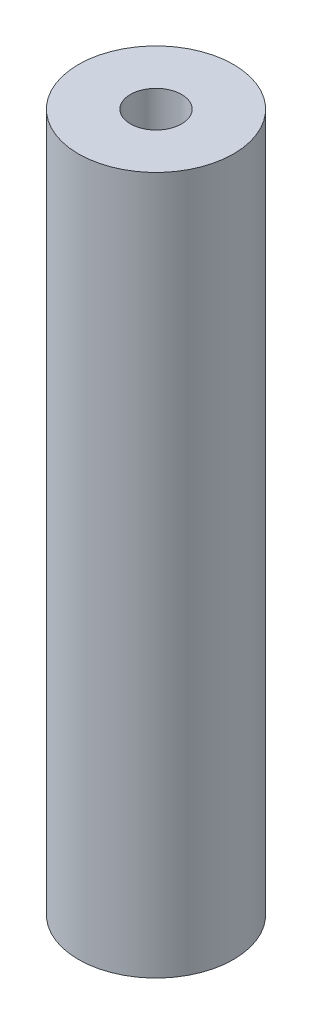
ISO-10303-21;
HEADER;
FILE_DESCRIPTION(('STEP AP214'),'2;1');
FILE_NAME('part.step','',(''),(''),'','','');
FILE_SCHEMA(('AUTOMOTIVE_DESIGN { 1 0 10303 214 1 1 1 1 }'));
ENDSEC;
DATA;
#1=APPLICATION_CONTEXT('core data for automotive mechanical design processes');
#2=APPLICATION_PROTOCOL_DEFINITION('international standard','automotive_design',2000,#1);
#3=PRODUCT_CONTEXT('',#1,'mechanical');
#4=PRODUCT('Part','Part','',(#3));
#5=PRODUCT_RELATED_PRODUCT_CATEGORY('part','',(#4));
#6=PRODUCT_DEFINITION_FORMATION('','',#4);
#7=PRODUCT_DEFINITION_CONTEXT('part definition',#1,'design');
#8=PRODUCT_DEFINITION('design','',#6,#7);
#9=PRODUCT_DEFINITION_SHAPE('','',#8);
#10=(LENGTH_UNIT() NAMED_UNIT(*) SI_UNIT(.MILLI.,.METRE.));
#11=(NAMED_UNIT(*) PLANE_ANGLE_UNIT() SI_UNIT($,.RADIAN.));
#12=(NAMED_UNIT(*) SI_UNIT($,.STERADIAN.) SOLID_ANGLE_UNIT());
#13=UNCERTAINTY_MEASURE_WITH_UNIT(LENGTH_MEASURE(1.E-05),#10,'distance_accuracy_value','');
#14=(GEOMETRIC_REPRESENTATION_CONTEXT(3) GLOBAL_UNCERTAINTY_ASSIGNED_CONTEXT((#13)) GLOBAL_UNIT_ASSIGNED_CONTEXT((#10,
#11,#12)) REPRESENTATION_CONTEXT('',''));
#15=CARTESIAN_POINT('',(0.,0.,0.));
#16=DIRECTION('',(0.,0.,1.));
#17=DIRECTION('',(1.,0.,0.));
#18=AXIS2_PLACEMENT_3D('',#15,#16,#17);
#19=CARTESIAN_POINT('',(0.,45.,0.));
#20=DIRECTION('',(0.,-1.,0.));
#21=DIRECTION('',(0.,0.,-1.));
#22=AXIS2_PLACEMENT_3D('',#19,#20,#21);
#23=CYLINDRICAL_SURFACE('',#22,5.);
#24=CARTESIAN_POINT('',(0.,45.,0.));
#25=DIRECTION('',(0.,1.,0.));
#26=DIRECTION('',(0.,0.,1.));
#27=AXIS2_PLACEMENT_3D('',#24,#25,#26);
#28=CIRCLE('',#27,5.);
#29=CARTESIAN_POINT('',(0.,45.,-5.));
#30=VERTEX_POINT('',#29);
#31=EDGE_CURVE('E11',#30,#30,#28,.T.);
#32=CARTESIAN_POINT('',(0.,0.,0.));
#33=DIRECTION('',(0.,1.,0.));
#34=DIRECTION('',(0.,0.,1.));
#35=AXIS2_PLACEMENT_3D('',#32,#33,#34);
#36=CIRCLE('',#35,5.);
#37=CARTESIAN_POINT('',(0.,0.,-5.));
#38=VERTEX_POINT('',#37);
#39=EDGE_CURVE('E38',#38,#38,#36,.T.);
#40=CARTESIAN_POINT('',(0.,45.,-5.));
#41=CARTESIAN_POINT('',(0.,44.53125,-5.));
#42=CARTESIAN_POINT('',(0.,44.0625,-5.));
#43=CARTESIAN_POINT('',(0.,43.125,-5.));
#44=CARTESIAN_POINT('',(0.,42.65625,-5.));
#45=CARTESIAN_POINT('',(0.,41.71875,-5.));
#46=CARTESIAN_POINT('',(0.,41.25,-5.));
#47=CARTESIAN_POINT('',(0.,40.3125,-5.));
#48=CARTESIAN_POINT('',(0.,39.84375,-5.));
#49=CARTESIAN_POINT('',(0.,38.90625,-5.));
#50=CARTESIAN_POINT('',(0.,38.4375,-5.));
#51=CARTESIAN_POINT('',(0.,37.5,-5.));
#52=CARTESIAN_POINT('',(0.,37.03125,-5.));
#53=CARTESIAN_POINT('',(0.,36.09375,-5.));
#54=CARTESIAN_POINT('',(0.,35.625,-5.));
#55=CARTESIAN_POINT('',(0.,34.6875,-5.));
#56=CARTESIAN_POINT('',(0.,34.21875,-5.));
#57=CARTESIAN_POINT('',(0.,33.28125,-5.));
#58=CARTESIAN_POINT('',(0.,32.8125,-5.));
#59=CARTESIAN_POINT('',(0.,31.875,-5.));
#60=CARTESIAN_POINT('',(0.,31.40625,-5.));
#61=CARTESIAN_POINT('',(0.,30.46875,-5.));
#62=CARTESIAN_POINT('',(0.,30.,-5.));
#63=CARTESIAN_POINT('',(0.,29.0625,-5.));
#64=CARTESIAN_POINT('',(0.,28.59375,-5.));
#65=CARTESIAN_POINT('',(0.,27.65625,-5.));
#66=CARTESIAN_POINT('',(0.,27.1875,-5.));
#67=CARTESIAN_POINT('',(0.,26.25,-5.));
#68=CARTESIAN_POINT('',(0.,25.78125,-5.));
#69=CARTESIAN_POINT('',(0.,24.84375,-5.));
#70=CARTESIAN_POINT('',(0.,24.375,-5.));
#71=CARTESIAN_POINT('',(0.,23.4375,-5.));
#72=CARTESIAN_POINT('',(0.,22.96875,-5.));
#73=CARTESIAN_POINT('',(0.,22.03125,-5.));
#74=CARTESIAN_POINT('',(0.,21.5625,-5.));
#75=CARTESIAN_POINT('',(0.,20.625,-5.));
#76=CARTESIAN_POINT('',(0.,20.15625,-5.));
#77=CARTESIAN_POINT('',(0.,19.21875,-5.));
#78=CARTESIAN_POINT('',(0.,18.75,-5.));
#79=CARTESIAN_POINT('',(0.,17.8125,-5.));
#80=CARTESIAN_POINT('',(0.,17.34375,-5.));
#81=CARTESIAN_POINT('',(0.,16.40625,-5.));
#82=CARTESIAN_POINT('',(0.,15.9375,-5.));
#83=CARTESIAN_POINT('',(0.,15.,-5.));
#84=CARTESIAN_POINT('',(0.,14.53125,-5.));
#85=CARTESIAN_POINT('',(0.,13.59375,-5.));
#86=CARTESIAN_POINT('',(0.,13.125,-5.));
#87=CARTESIAN_POINT('',(0.,12.1875,-5.));
#88=CARTESIAN_POINT('',(0.,11.71875,-5.));
#89=CARTESIAN_POINT('',(0.,10.78125,-5.));
#90=CARTESIAN_POINT('',(0.,10.3125,-5.));
#91=CARTESIAN_POINT('',(0.,9.375,-5.));
#92=CARTESIAN_POINT('',(0.,8.90625,-5.));
#93=CARTESIAN_POINT('',(0.,7.96874999999999,-5.));
#94=CARTESIAN_POINT('',(0.,7.5,-5.));
#95=CARTESIAN_POINT('',(0.,6.5625,-5.));
#96=CARTESIAN_POINT('',(0.,6.09375,-5.));
#97=CARTESIAN_POINT('',(0.,5.15625,-5.));
#98=CARTESIAN_POINT('',(0.,4.68749999999999,-5.));
#99=CARTESIAN_POINT('',(0.,3.74999999999999,-5.));
#100=CARTESIAN_POINT('',(0.,3.28124999999999,-5.));
#101=CARTESIAN_POINT('',(0.,2.34374999999999,-5.));
#102=CARTESIAN_POINT('',(0.,1.87499999999999,-5.));
#103=CARTESIAN_POINT('',(0.,0.937499999999992,-5.));
#104=CARTESIAN_POINT('',(0.,0.468749999999993,-5.));
#105=CARTESIAN_POINT('',(0.,0.,-5.));
#106=B_SPLINE_CURVE_WITH_KNOTS('',3,(#40,#41,#42,#43,#44,#45,#46,#47,#48,#49,#50,#51,#52,#53,
#54,#55,#56,#57,#58,#59,#60,#61,#62,#63,#64,#65,#66,#67,#68,#69,#70,#71,#72,#73,#74,#75,#76,#77,
#78,#79,#80,#81,#82,#83,#84,#85,#86,#87,#88,#89,#90,#91,#92,#93,#94,#95,#96,#97,#98,#99,#100,
#101,#102,#103,#104,#105),.UNSPECIFIED.,.F.,.F.,(4,2,2,2,2,2,2,2,2,2,2,2,2,2,2,2,2,2,2,2,2,2,2,
2,2,2,2,2,2,2,2,2,4),(0.,1.40625,2.8125,4.21875000000001,5.62500000000001,7.03125,8.4375,
9.84375000000001,11.25,12.65625,14.0625,15.46875,16.875,18.28125,19.6875,21.09375,22.5,23.90625,
25.3125,26.71875,28.125,29.53125,30.9375,32.34375,33.75,35.15625,36.5625,37.96875,39.375,
40.78125,42.1875,43.59375,45.),.UNSPECIFIED.);
#107=EDGE_CURVE('BSEAM35',#30,#38,#106,.T.);
#108=ORIENTED_EDGE('',*,*,#31,.F.);
#109=ORIENTED_EDGE('',*,*,#39,.T.);
#110=ORIENTED_EDGE('',*,*,#107,.T.);
#111=ORIENTED_EDGE('',*,*,#107,.F.);
#112=EDGE_LOOP('',(#108,#110,#109,#111));
#113=FACE_BOUND('',#112,.T.);
#114=ADVANCED_FACE('F35',(#113),#23,.T.);
#115=CARTESIAN_POINT('',(0.,45.,0.));
#116=DIRECTION('',(0.,1.,0.));
#117=DIRECTION('',(0.,0.,1.));
#118=AXIS2_PLACEMENT_3D('',#115,#116,#117);
#119=PLANE('',#118);
#120=CARTESIAN_POINT('',(0.,45.,0.));
#121=DIRECTION('',(0.,1.,0.));
#122=DIRECTION('',(0.,0.,1.));
#123=AXIS2_PLACEMENT_3D('',#120,#121,#122);
#124=CIRCLE('',#123,1.64999999999999);
#125=CARTESIAN_POINT('',(0.,45.,1.64999999999999));
#126=VERTEX_POINT('',#125);
#127=EDGE_CURVE('E58',#126,#126,#124,.T.);
#128=ORIENTED_EDGE('',*,*,#127,.F.);
#129=EDGE_LOOP('',(#128));
#130=FACE_BOUND('',#129,.T.);
#131=ORIENTED_EDGE('',*,*,#31,.T.);
#132=EDGE_LOOP('',(#131));
#133=FACE_BOUND('',#132,.T.);
#134=ADVANCED_FACE('F77',(#130,#133),#119,.T.);
#135=CARTESIAN_POINT('',(0.,0.,0.));
#136=DIRECTION('',(0.,1.,0.));
#137=DIRECTION('',(0.,0.,1.));
#138=AXIS2_PLACEMENT_3D('',#135,#136,#137);
#139=PLANE('',#138);
#140=CARTESIAN_POINT('',(0.,0.,0.));
#141=DIRECTION('',(0.,-1.,0.));
#142=DIRECTION('',(0.,0.,-1.));
#143=AXIS2_PLACEMENT_3D('',#140,#141,#142);
#144=CIRCLE('',#143,1.64999999999999);
#145=CARTESIAN_POINT('',(0.,0.,-1.64999999999999));
#146=VERTEX_POINT('',#145);
#147=EDGE_CURVE('E59',#146,#146,#144,.T.);
#148=ORIENTED_EDGE('',*,*,#147,.F.);
#149=EDGE_LOOP('',(#148));
#150=FACE_BOUND('',#149,.T.);
#151=ORIENTED_EDGE('',*,*,#39,.F.);
#152=EDGE_LOOP('',(#151));
#153=FACE_BOUND('',#152,.T.);
#154=ADVANCED_FACE('F74',(#150,#153),#139,.F.);
#155=CARTESIAN_POINT('',(0.,30.,0.));
#156=DIRECTION('',(0.,1.,0.));
#157=DIRECTION('',(0.,0.,1.));
#158=AXIS2_PLACEMENT_3D('',#155,#156,#157);
#159=CONICAL_SURFACE('',#158,1.64999999999999,1.02974425867665);
#160=CARTESIAN_POINT('',(0.,29.0085799786045,0.));
#161=VERTEX_POINT('',#160);
#162=VERTEX_LOOP('',#161);
#163=FACE_BOUND('',#162,.T.);
#164=CARTESIAN_POINT('',(0.,30.,0.));
#165=DIRECTION('',(0.,1.,0.));
#166=DIRECTION('',(0.,0.,1.));
#167=AXIS2_PLACEMENT_3D('',#164,#165,#166);
#168=CIRCLE('',#167,1.64999999999999);
#169=CARTESIAN_POINT('',(0.,30.,1.64999999999999));
#170=VERTEX_POINT('',#169);
#171=EDGE_CURVE('E62',#170,#170,#168,.T.);
#172=ORIENTED_EDGE('',*,*,#171,.T.);
#173=EDGE_LOOP('',(#172));
#174=FACE_BOUND('',#173,.T.);
#175=ADVANCED_FACE('F76',(#163,#174),#159,.F.);
#176=CARTESIAN_POINT('',(0.,45.,0.));
#177=DIRECTION('',(0.,1.,0.));
#178=DIRECTION('',(0.,0.,1.));
#179=AXIS2_PLACEMENT_3D('',#176,#177,#178);
#180=CYLINDRICAL_SURFACE('',#179,1.64999999999999);
#181=ORIENTED_EDGE('',*,*,#171,.F.);
#182=EDGE_LOOP('',(#181));
#183=FACE_BOUND('',#182,.T.);
#184=ORIENTED_EDGE('',*,*,#127,.T.);
#185=EDGE_LOOP('',(#184));
#186=FACE_BOUND('',#185,.T.);
#187=ADVANCED_FACE('F52',(#183,#186),#180,.F.);
#188=CARTESIAN_POINT('',(0.,15.,0.));
#189=DIRECTION('',(0.,-1.,0.));
#190=DIRECTION('',(0.,0.,-1.));
#191=AXIS2_PLACEMENT_3D('',#188,#189,#190);
#192=CONICAL_SURFACE('',#191,1.64999999999999,1.02974425867665);
#193=CARTESIAN_POINT('',(0.,15.9914200213955,0.));
#194=VERTEX_POINT('',#193);
#195=VERTEX_LOOP('',#194);
#196=FACE_BOUND('',#195,.T.);
#197=CARTESIAN_POINT('',(0.,15.,0.));
#198=DIRECTION('',(0.,-1.,0.));
#199=DIRECTION('',(0.,0.,-1.));
#200=AXIS2_PLACEMENT_3D('',#197,#198,#199);
#201=CIRCLE('',#200,1.64999999999999);
#202=CARTESIAN_POINT('',(0.,15.,-1.64999999999999));
#203=VERTEX_POINT('',#202);
#204=EDGE_CURVE('E56',#203,#203,#201,.T.);
#205=ORIENTED_EDGE('',*,*,#204,.T.);
#206=EDGE_LOOP('',(#205));
#207=FACE_BOUND('',#206,.T.);
#208=ADVANCED_FACE('F48',(#196,#207),#192,.F.);
#209=CARTESIAN_POINT('',(0.,0.,0.));
#210=DIRECTION('',(0.,-1.,0.));
#211=DIRECTION('',(0.,0.,-1.));
#212=AXIS2_PLACEMENT_3D('',#209,#210,#211);
#213=CYLINDRICAL_SURFACE('',#212,1.64999999999999);
#214=ORIENTED_EDGE('',*,*,#204,.F.);
#215=EDGE_LOOP('',(#214));
#216=FACE_BOUND('',#215,.T.);
#217=ORIENTED_EDGE('',*,*,#147,.T.);
#218=EDGE_LOOP('',(#217));
#219=FACE_BOUND('',#218,.T.);
#220=ADVANCED_FACE('F51',(#216,#219),#213,.F.);
#221=CLOSED_SHELL('',(#114,#134,#154,#175,#187,#208,#220));
#222=MANIFOLD_SOLID_BREP('B2',#221);
#223=ADVANCED_BREP_SHAPE_REPRESENTATION('',(#18,#222),#14);
#224=SHAPE_DEFINITION_REPRESENTATION(#9,#223);
ENDSEC;
END-ISO-10303-21;
